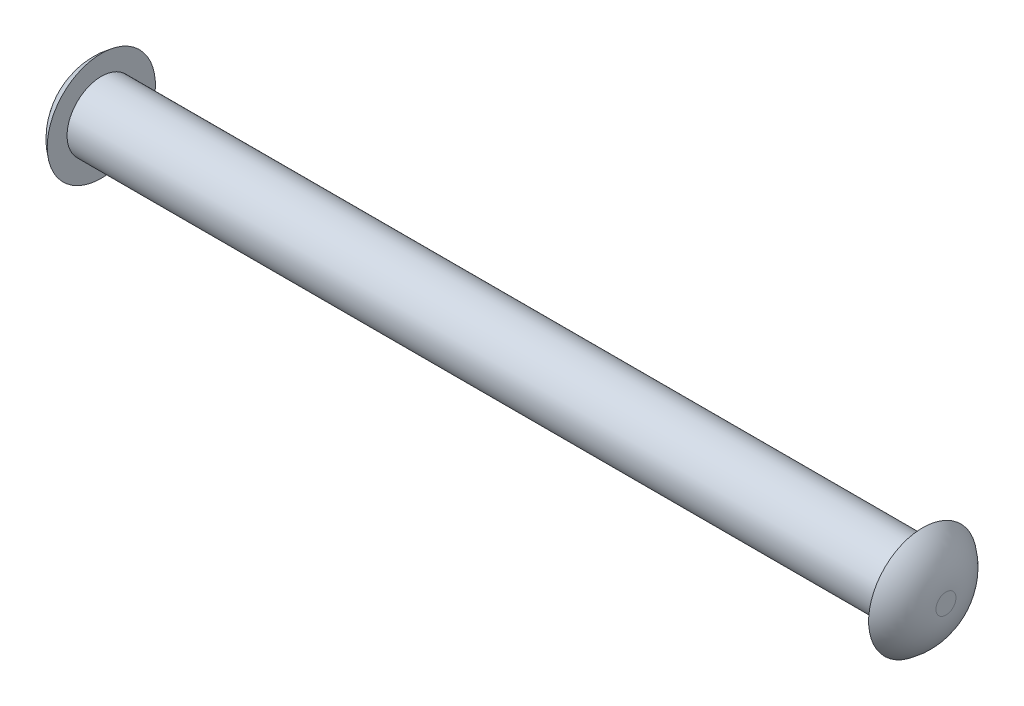
ISO-10303-21;
HEADER;
FILE_DESCRIPTION(('STEP AP214'),'2;1');
FILE_NAME('part.step','',(''),(''),'','','');
FILE_SCHEMA(('AUTOMOTIVE_DESIGN { 1 0 10303 214 1 1 1 1 }'));
ENDSEC;
DATA;
#1=APPLICATION_CONTEXT('core data for automotive mechanical design processes');
#2=APPLICATION_PROTOCOL_DEFINITION('international standard','automotive_design',2000,#1);
#3=PRODUCT_CONTEXT('',#1,'mechanical');
#4=PRODUCT('Part','Part','',(#3));
#5=PRODUCT_RELATED_PRODUCT_CATEGORY('part','',(#4));
#6=PRODUCT_DEFINITION_FORMATION('','',#4);
#7=PRODUCT_DEFINITION_CONTEXT('part definition',#1,'design');
#8=PRODUCT_DEFINITION('design','',#6,#7);
#9=PRODUCT_DEFINITION_SHAPE('','',#8);
#10=(LENGTH_UNIT() NAMED_UNIT(*) SI_UNIT(.MILLI.,.METRE.));
#11=(NAMED_UNIT(*) PLANE_ANGLE_UNIT() SI_UNIT($,.RADIAN.));
#12=(NAMED_UNIT(*) SI_UNIT($,.STERADIAN.) SOLID_ANGLE_UNIT());
#13=UNCERTAINTY_MEASURE_WITH_UNIT(LENGTH_MEASURE(1.E-05),#10,'distance_accuracy_value','');
#14=(GEOMETRIC_REPRESENTATION_CONTEXT(3) GLOBAL_UNCERTAINTY_ASSIGNED_CONTEXT((#13)) GLOBAL_UNIT_ASSIGNED_CONTEXT((#10,
#11,#12)) REPRESENTATION_CONTEXT('',''));
#15=CARTESIAN_POINT('',(0.,0.,0.));
#16=DIRECTION('',(0.,0.,1.));
#17=DIRECTION('',(1.,0.,0.));
#18=AXIS2_PLACEMENT_3D('',#15,#16,#17);
#19=CARTESIAN_POINT('',(60.,0.,0.));
#20=DIRECTION('',(-1.,0.,0.));
#21=DIRECTION('',(0.,0.,1.));
#22=AXIS2_PLACEMENT_3D('',#19,#20,#21);
#23=CYLINDRICAL_SURFACE('',#22,2.5);
#24=CARTESIAN_POINT('',(60.,0.,0.));
#25=DIRECTION('',(1.,0.,0.));
#26=DIRECTION('',(0.,0.,-1.));
#27=AXIS2_PLACEMENT_3D('',#24,#25,#26);
#28=CIRCLE('',#27,2.5);
#29=CARTESIAN_POINT('',(60.,0.,-2.5));
#30=VERTEX_POINT('',#29);
#31=EDGE_CURVE('E50',#30,#30,#28,.T.);
#32=ORIENTED_EDGE('',*,*,#31,.F.);
#33=EDGE_LOOP('',(#32));
#34=FACE_BOUND('',#33,.T.);
#35=CARTESIAN_POINT('',(0.,0.,0.));
#36=DIRECTION('',(1.,0.,0.));
#37=DIRECTION('',(0.,0.,-1.));
#38=AXIS2_PLACEMENT_3D('',#35,#36,#37);
#39=CIRCLE('',#38,2.5);
#40=CARTESIAN_POINT('',(0.,0.,-2.5));
#41=VERTEX_POINT('',#40);
#42=EDGE_CURVE('E54',#41,#41,#39,.T.);
#43=ORIENTED_EDGE('',*,*,#42,.T.);
#44=EDGE_LOOP('',(#43));
#45=FACE_BOUND('',#44,.T.);
#46=ADVANCED_FACE('F39',(#34,#45),#23,.T.);
#47=CARTESIAN_POINT('',(-1.7,0.,0.));
#48=DIRECTION('',(-1.,0.,0.));
#49=DIRECTION('',(0.,0.,1.));
#50=AXIS2_PLACEMENT_3D('',#47,#48,#49);
#51=PLANE('',#50);
#52=CARTESIAN_POINT('',(-1.7,0.,0.));
#53=DIRECTION('',(-1.,0.,0.));
#54=DIRECTION('',(0.,0.,1.));
#55=AXIS2_PLACEMENT_3D('',#52,#53,#54);
#56=CIRCLE('',#55,0.729751562379077);
#57=CARTESIAN_POINT('',(-1.7,0.,0.729751562379077));
#58=VERTEX_POINT('',#57);
#59=EDGE_CURVE('E10',#58,#58,#56,.T.);
#60=ORIENTED_EDGE('',*,*,#59,.T.);
#61=EDGE_LOOP('',(#60));
#62=FACE_BOUND('',#61,.T.);
#63=ADVANCED_FACE('F84',(#62),#51,.T.);
#64=CARTESIAN_POINT('',(0.,0.,0.));
#65=DIRECTION('',(-1.,0.,0.));
#66=DIRECTION('',(0.,0.,1.));
#67=AXIS2_PLACEMENT_3D('',#64,#65,#66);
#68=PLANE('',#67);
#69=ORIENTED_EDGE('',*,*,#42,.F.);
#70=EDGE_LOOP('',(#69));
#71=FACE_BOUND('',#70,.T.);
#72=CARTESIAN_POINT('',(0.,0.,0.));
#73=DIRECTION('',(-1.,0.,0.));
#74=DIRECTION('',(0.,0.,1.));
#75=AXIS2_PLACEMENT_3D('',#72,#73,#74);
#76=CIRCLE('',#75,3.95);
#77=CARTESIAN_POINT('',(0.,0.,3.95));
#78=VERTEX_POINT('',#77);
#79=EDGE_CURVE('E58',#78,#78,#76,.T.);
#80=ORIENTED_EDGE('',*,*,#79,.F.);
#81=EDGE_LOOP('',(#80));
#82=FACE_BOUND('',#81,.T.);
#83=ADVANCED_FACE('F80',(#71,#82),#68,.F.);
#84=CARTESIAN_POINT('',(61.7,0.,0.));
#85=DIRECTION('',(1.,0.,0.));
#86=DIRECTION('',(0.,0.,-1.));
#87=AXIS2_PLACEMENT_3D('',#84,#85,#86);
#88=PLANE('',#87);
#89=CARTESIAN_POINT('',(61.7,0.,0.));
#90=DIRECTION('',(1.,0.,0.));
#91=DIRECTION('',(0.,0.,-1.));
#92=AXIS2_PLACEMENT_3D('',#89,#90,#91);
#93=CIRCLE('',#92,0.729751562379078);
#94=CARTESIAN_POINT('',(61.7,0.,-0.729751562379078));
#95=VERTEX_POINT('',#94);
#96=EDGE_CURVE('E46',#95,#95,#93,.T.);
#97=ORIENTED_EDGE('',*,*,#96,.T.);
#98=EDGE_LOOP('',(#97));
#99=FACE_BOUND('',#98,.T.);
#100=ADVANCED_FACE('F71',(#99),#88,.T.);
#101=CARTESIAN_POINT('',(60.,0.,0.));
#102=DIRECTION('',(1.,0.,0.));
#103=DIRECTION('',(0.,0.,-1.));
#104=AXIS2_PLACEMENT_3D('',#101,#102,#103);
#105=PLANE('',#104);
#106=ORIENTED_EDGE('',*,*,#31,.T.);
#107=EDGE_LOOP('',(#106));
#108=FACE_BOUND('',#107,.T.);
#109=CARTESIAN_POINT('',(60.,0.,0.));
#110=DIRECTION('',(1.,0.,0.));
#111=DIRECTION('',(0.,0.,-1.));
#112=AXIS2_PLACEMENT_3D('',#109,#110,#111);
#113=CIRCLE('',#112,3.95);
#114=CARTESIAN_POINT('',(60.,0.,-3.95));
#115=VERTEX_POINT('',#114);
#116=EDGE_CURVE('E62',#115,#115,#113,.T.);
#117=ORIENTED_EDGE('',*,*,#116,.F.);
#118=EDGE_LOOP('',(#117));
#119=FACE_BOUND('',#118,.T.);
#120=ADVANCED_FACE('F69',(#108,#119),#105,.F.);
#121=CARTESIAN_POINT('',(57.8,0.,0.));
#122=DIRECTION('',(-1.,0.,0.));
#123=DIRECTION('',(0.,0.,1.));
#124=AXIS2_PLACEMENT_3D('',#121,#122,#123);
#125=DEGENERATE_TOROIDAL_SURFACE('',#124,0.729751562379078,3.9,.T.);
#126=ORIENTED_EDGE('',*,*,#116,.T.);
#127=EDGE_LOOP('',(#126));
#128=FACE_BOUND('',#127,.T.);
#129=ORIENTED_EDGE('',*,*,#96,.F.);
#130=EDGE_LOOP('',(#129));
#131=FACE_BOUND('',#130,.T.);
#132=ADVANCED_FACE('F66',(#128,#131),#125,.T.);
#133=CARTESIAN_POINT('',(2.2,0.,0.));
#134=DIRECTION('',(1.,0.,0.));
#135=DIRECTION('',(0.,0.,-1.));
#136=AXIS2_PLACEMENT_3D('',#133,#134,#135);
#137=DEGENERATE_TOROIDAL_SURFACE('',#136,0.729751562379077,3.9,.T.);
#138=ORIENTED_EDGE('',*,*,#79,.T.);
#139=EDGE_LOOP('',(#138));
#140=FACE_BOUND('',#139,.T.);
#141=ORIENTED_EDGE('',*,*,#59,.F.);
#142=EDGE_LOOP('',(#141));
#143=FACE_BOUND('',#142,.T.);
#144=ADVANCED_FACE('F41',(#140,#143),#137,.T.);
#145=CLOSED_SHELL('',(#46,#63,#83,#100,#120,#132,#144));
#146=MANIFOLD_SOLID_BREP('B2',#145);
#147=ADVANCED_BREP_SHAPE_REPRESENTATION('',(#18,#146),#14);
#148=SHAPE_DEFINITION_REPRESENTATION(#9,#147);
ENDSEC;
END-ISO-10303-21;
